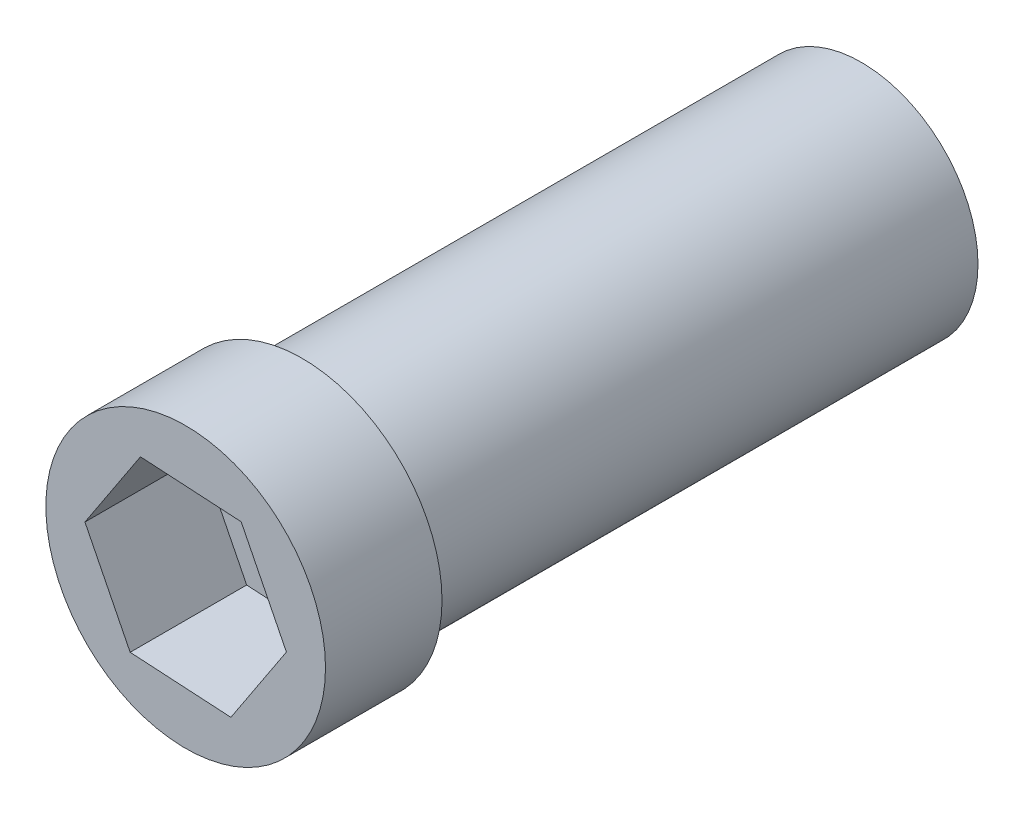
ISO-10303-21;
HEADER;
FILE_DESCRIPTION(('STEP AP214'),'2;1');
FILE_NAME('part.step','',(''),(''),'','','');
FILE_SCHEMA(('AUTOMOTIVE_DESIGN { 1 0 10303 214 1 1 1 1 }'));
ENDSEC;
DATA;
#1=APPLICATION_CONTEXT('core data for automotive mechanical design processes');
#2=APPLICATION_PROTOCOL_DEFINITION('international standard','automotive_design',2000,#1);
#3=PRODUCT_CONTEXT('',#1,'mechanical');
#4=PRODUCT('Part','Part','',(#3));
#5=PRODUCT_RELATED_PRODUCT_CATEGORY('part','',(#4));
#6=PRODUCT_DEFINITION_FORMATION('','',#4);
#7=PRODUCT_DEFINITION_CONTEXT('part definition',#1,'design');
#8=PRODUCT_DEFINITION('design','',#6,#7);
#9=PRODUCT_DEFINITION_SHAPE('','',#8);
#10=(LENGTH_UNIT() NAMED_UNIT(*) SI_UNIT(.MILLI.,.METRE.));
#11=(NAMED_UNIT(*) PLANE_ANGLE_UNIT() SI_UNIT($,.RADIAN.));
#12=(NAMED_UNIT(*) SI_UNIT($,.STERADIAN.) SOLID_ANGLE_UNIT());
#13=UNCERTAINTY_MEASURE_WITH_UNIT(LENGTH_MEASURE(1.E-05),#10,'distance_accuracy_value','');
#14=(GEOMETRIC_REPRESENTATION_CONTEXT(3) GLOBAL_UNCERTAINTY_ASSIGNED_CONTEXT((#13)) GLOBAL_UNIT_ASSIGNED_CONTEXT((#10,
#11,#12)) REPRESENTATION_CONTEXT('',''));
#15=CARTESIAN_POINT('',(0.,0.,0.));
#16=DIRECTION('',(0.,0.,1.));
#17=DIRECTION('',(1.,0.,0.));
#18=AXIS2_PLACEMENT_3D('',#15,#16,#17);
#19=CARTESIAN_POINT('',(0.,0.,-15.24));
#20=DIRECTION('',(0.,0.,1.));
#21=DIRECTION('',(1.,0.,0.));
#22=AXIS2_PLACEMENT_3D('',#19,#20,#21);
#23=CYLINDRICAL_SURFACE('',#22,3.175);
#24=CARTESIAN_POINT('',(0.,0.,-15.24));
#25=DIRECTION('',(0.,0.,1.));
#26=DIRECTION('',(1.,0.,0.));
#27=AXIS2_PLACEMENT_3D('',#24,#25,#26);
#28=CIRCLE('',#27,3.175);
#29=CARTESIAN_POINT('',(3.175,0.,-15.24));
#30=VERTEX_POINT('',#29);
#31=EDGE_CURVE('E11',#30,#30,#28,.T.);
#32=CARTESIAN_POINT('',(0.,0.,0.));
#33=DIRECTION('',(0.,0.,1.));
#34=DIRECTION('',(1.,0.,0.));
#35=AXIS2_PLACEMENT_3D('',#32,#33,#34);
#36=CIRCLE('',#35,3.175);
#37=CARTESIAN_POINT('',(3.175,0.,0.));
#38=VERTEX_POINT('',#37);
#39=EDGE_CURVE('E42',#38,#38,#36,.T.);
#40=CARTESIAN_POINT('',(3.175,0.,-15.24));
#41=CARTESIAN_POINT('',(3.175,0.,-15.08125));
#42=CARTESIAN_POINT('',(3.175,0.,-14.9225));
#43=CARTESIAN_POINT('',(3.175,0.,-14.605));
#44=CARTESIAN_POINT('',(3.175,0.,-14.44625));
#45=CARTESIAN_POINT('',(3.175,0.,-14.12875));
#46=CARTESIAN_POINT('',(3.175,0.,-13.97));
#47=CARTESIAN_POINT('',(3.175,0.,-13.6525));
#48=CARTESIAN_POINT('',(3.175,0.,-13.49375));
#49=CARTESIAN_POINT('',(3.175,0.,-13.17625));
#50=CARTESIAN_POINT('',(3.175,0.,-13.0175));
#51=CARTESIAN_POINT('',(3.175,0.,-12.7));
#52=CARTESIAN_POINT('',(3.175,0.,-12.54125));
#53=CARTESIAN_POINT('',(3.175,0.,-12.22375));
#54=CARTESIAN_POINT('',(3.175,0.,-12.065));
#55=CARTESIAN_POINT('',(3.175,0.,-11.7475));
#56=CARTESIAN_POINT('',(3.175,0.,-11.58875));
#57=CARTESIAN_POINT('',(3.175,0.,-11.27125));
#58=CARTESIAN_POINT('',(3.175,0.,-11.1125));
#59=CARTESIAN_POINT('',(3.175,0.,-10.795));
#60=CARTESIAN_POINT('',(3.175,0.,-10.63625));
#61=CARTESIAN_POINT('',(3.175,0.,-10.31875));
#62=CARTESIAN_POINT('',(3.175,0.,-10.16));
#63=CARTESIAN_POINT('',(3.175,0.,-9.8425));
#64=CARTESIAN_POINT('',(3.175,0.,-9.68375));
#65=CARTESIAN_POINT('',(3.175,0.,-9.36625));
#66=CARTESIAN_POINT('',(3.175,0.,-9.2075));
#67=CARTESIAN_POINT('',(3.175,0.,-8.89));
#68=CARTESIAN_POINT('',(3.175,0.,-8.73125));
#69=CARTESIAN_POINT('',(3.175,0.,-8.41375));
#70=CARTESIAN_POINT('',(3.175,0.,-8.255));
#71=CARTESIAN_POINT('',(3.175,0.,-7.9375));
#72=CARTESIAN_POINT('',(3.175,0.,-7.77875));
#73=CARTESIAN_POINT('',(3.175,0.,-7.46125));
#74=CARTESIAN_POINT('',(3.175,0.,-7.3025));
#75=CARTESIAN_POINT('',(3.175,0.,-6.985));
#76=CARTESIAN_POINT('',(3.175,0.,-6.82625));
#77=CARTESIAN_POINT('',(3.175,0.,-6.50875));
#78=CARTESIAN_POINT('',(3.175,0.,-6.35));
#79=CARTESIAN_POINT('',(3.175,0.,-6.0325));
#80=CARTESIAN_POINT('',(3.175,0.,-5.87375));
#81=CARTESIAN_POINT('',(3.175,0.,-5.55625));
#82=CARTESIAN_POINT('',(3.175,0.,-5.3975));
#83=CARTESIAN_POINT('',(3.175,0.,-5.08));
#84=CARTESIAN_POINT('',(3.175,0.,-4.92125));
#85=CARTESIAN_POINT('',(3.175,0.,-4.60375));
#86=CARTESIAN_POINT('',(3.175,0.,-4.445));
#87=CARTESIAN_POINT('',(3.175,0.,-4.1275));
#88=CARTESIAN_POINT('',(3.175,0.,-3.96875));
#89=CARTESIAN_POINT('',(3.175,0.,-3.65125));
#90=CARTESIAN_POINT('',(3.175,0.,-3.4925));
#91=CARTESIAN_POINT('',(3.175,0.,-3.175));
#92=CARTESIAN_POINT('',(3.175,0.,-3.01625));
#93=CARTESIAN_POINT('',(3.175,0.,-2.69875));
#94=CARTESIAN_POINT('',(3.175,0.,-2.54));
#95=CARTESIAN_POINT('',(3.175,0.,-2.2225));
#96=CARTESIAN_POINT('',(3.175,0.,-2.06375));
#97=CARTESIAN_POINT('',(3.175,0.,-1.74625));
#98=CARTESIAN_POINT('',(3.175,0.,-1.5875));
#99=CARTESIAN_POINT('',(3.175,0.,-1.27));
#100=CARTESIAN_POINT('',(3.175,0.,-1.11125));
#101=CARTESIAN_POINT('',(3.175,0.,-0.79375));
#102=CARTESIAN_POINT('',(3.175,0.,-0.634999999999999));
#103=CARTESIAN_POINT('',(3.175,0.,-0.3175));
#104=CARTESIAN_POINT('',(3.175,0.,-0.15875));
#105=CARTESIAN_POINT('',(3.175,0.,0.));
#106=B_SPLINE_CURVE_WITH_KNOTS('',3,(#40,#41,#42,#43,#44,#45,#46,#47,#48,#49,#50,#51,#52,#53,
#54,#55,#56,#57,#58,#59,#60,#61,#62,#63,#64,#65,#66,#67,#68,#69,#70,#71,#72,#73,#74,#75,#76,#77,
#78,#79,#80,#81,#82,#83,#84,#85,#86,#87,#88,#89,#90,#91,#92,#93,#94,#95,#96,#97,#98,#99,#100,
#101,#102,#103,#104,#105),.UNSPECIFIED.,.F.,.F.,(4,2,2,2,2,2,2,2,2,2,2,2,2,2,2,2,2,2,2,2,2,2,2,
2,2,2,2,2,2,2,2,2,4),(0.,0.476250000000001,0.9525,1.42875,1.905,2.38125,2.8575,3.33375,3.81,
4.28625,4.7625,5.23875,5.715,6.19125,6.6675,7.14375,7.62,8.09625,8.5725,9.04875,9.525,10.00125,
10.4775,10.95375,11.43,11.90625,12.3825,12.85875,13.335,13.81125,14.2875,14.76375,15.24),.UNSPECIFIED.);
#107=EDGE_CURVE('BSEAM39',#30,#38,#106,.T.);
#108=ORIENTED_EDGE('',*,*,#31,.T.);
#109=ORIENTED_EDGE('',*,*,#39,.F.);
#110=ORIENTED_EDGE('',*,*,#107,.T.);
#111=ORIENTED_EDGE('',*,*,#107,.F.);
#112=EDGE_LOOP('',(#108,#110,#109,#111));
#113=FACE_BOUND('',#112,.T.);
#114=ADVANCED_FACE('F39',(#113),#23,.T.);
#115=CARTESIAN_POINT('',(0.,0.,-15.24));
#116=DIRECTION('',(0.,0.,1.));
#117=DIRECTION('',(1.,0.,0.));
#118=AXIS2_PLACEMENT_3D('',#115,#116,#117);
#119=PLANE('',#118);
#120=ORIENTED_EDGE('',*,*,#31,.F.);
#121=EDGE_LOOP('',(#120));
#122=FACE_BOUND('',#121,.T.);
#123=ADVANCED_FACE('F190',(#122),#119,.F.);
#124=CARTESIAN_POINT('',(0.,0.,3.175));
#125=DIRECTION('',(0.,0.,-1.));
#126=DIRECTION('',(-1.,0.,0.));
#127=AXIS2_PLACEMENT_3D('',#124,#125,#126);
#128=CYLINDRICAL_SURFACE('',#127,3.81);
#129=CARTESIAN_POINT('',(0.,0.,3.175));
#130=DIRECTION('',(0.,0.,1.));
#131=DIRECTION('',(1.,0.,0.));
#132=AXIS2_PLACEMENT_3D('',#129,#130,#131);
#133=CIRCLE('',#132,3.81);
#134=CARTESIAN_POINT('',(3.81,0.,3.175));
#135=VERTEX_POINT('',#134);
#136=EDGE_CURVE('E163',#135,#135,#133,.T.);
#137=ORIENTED_EDGE('',*,*,#136,.F.);
#138=EDGE_LOOP('',(#137));
#139=FACE_BOUND('',#138,.T.);
#140=CARTESIAN_POINT('',(0.,0.,0.));
#141=DIRECTION('',(0.,0.,1.));
#142=DIRECTION('',(1.,0.,0.));
#143=AXIS2_PLACEMENT_3D('',#140,#141,#142);
#144=CIRCLE('',#143,3.81);
#145=CARTESIAN_POINT('',(3.81,0.,0.));
#146=VERTEX_POINT('',#145);
#147=EDGE_CURVE('E153',#146,#146,#144,.T.);
#148=ORIENTED_EDGE('',*,*,#147,.T.);
#149=EDGE_LOOP('',(#148));
#150=FACE_BOUND('',#149,.T.);
#151=ADVANCED_FACE('F171',(#139,#150),#128,.T.);
#152=CARTESIAN_POINT('',(0.,0.,3.175));
#153=DIRECTION('',(0.,0.,1.));
#154=DIRECTION('',(1.,0.,0.));
#155=AXIS2_PLACEMENT_3D('',#152,#153,#154);
#156=PLANE('',#155);
#157=DIRECTION('',(-0.550129463711656,-0.835079381350256,0.));
#158=VECTOR('',#157,1.);
#159=CARTESIAN_POINT('',(-1.23220635746574,2.45807571946452,3.175));
#160=LINE('',#159,#158);
#161=CARTESIAN_POINT('',(-1.23220635746574,2.45807571946452,3.175));
#162=VERTEX_POINT('',#161);
#163=CARTESIAN_POINT('',(-2.74485919621486,0.16191585146224,3.175));
#164=VERTEX_POINT('',#163);
#165=EDGE_CURVE('E54',#162,#164,#160,.T.);
#166=ORIENTED_EDGE('',*,*,#165,.F.);
#167=DIRECTION('',(-0.998264690281742,0.0588864002694755,0.));
#168=VECTOR('',#167,1.);
#169=CARTESIAN_POINT('',(1.51265283874911,2.29615986800228,3.175));
#170=LINE('',#169,#168);
#171=CARTESIAN_POINT('',(1.51265283874911,2.29615986800228,3.175));
#172=VERTEX_POINT('',#171);
#173=EDGE_CURVE('E147',#172,#162,#170,.T.);
#174=ORIENTED_EDGE('',*,*,#173,.F.);
#175=DIRECTION('',(-0.448135226570086,0.893965781619731,0.));
#176=VECTOR('',#175,1.);
#177=CARTESIAN_POINT('',(2.74485919621485,-0.161915851462241,3.175));
#178=LINE('',#177,#176);
#179=CARTESIAN_POINT('',(2.74485919621485,-0.161915851462241,3.175));
#180=VERTEX_POINT('',#179);
#181=EDGE_CURVE('E144',#180,#172,#178,.T.);
#182=ORIENTED_EDGE('',*,*,#181,.F.);
#183=DIRECTION('',(0.550129463711656,0.835079381350256,0.));
#184=VECTOR('',#183,1.);
#185=CARTESIAN_POINT('',(1.23220635746574,-2.45807571946452,3.175));
#186=LINE('',#185,#184);
#187=CARTESIAN_POINT('',(1.23220635746574,-2.45807571946452,3.175));
#188=VERTEX_POINT('',#187);
#189=EDGE_CURVE('E102',#188,#180,#186,.T.);
#190=ORIENTED_EDGE('',*,*,#189,.F.);
#191=DIRECTION('',(0.998264690281742,-0.0588864002694756,0.));
#192=VECTOR('',#191,1.);
#193=CARTESIAN_POINT('',(-1.51265283874912,-2.29615986800228,3.175));
#194=LINE('',#193,#192);
#195=CARTESIAN_POINT('',(-1.51265283874912,-2.29615986800228,3.175));
#196=VERTEX_POINT('',#195);
#197=EDGE_CURVE('E138',#196,#188,#194,.T.);
#198=ORIENTED_EDGE('',*,*,#197,.F.);
#199=DIRECTION('',(0.448135226570087,-0.893965781619731,0.));
#200=VECTOR('',#199,1.);
#201=CARTESIAN_POINT('',(-2.74485919621486,0.16191585146224,3.175));
#202=LINE('',#201,#200);
#203=EDGE_CURVE('E134',#164,#196,#202,.T.);
#204=ORIENTED_EDGE('',*,*,#203,.F.);
#205=EDGE_LOOP('',(#166,#174,#182,#190,#198,#204));
#206=FACE_BOUND('',#205,.T.);
#207=ORIENTED_EDGE('',*,*,#136,.T.);
#208=EDGE_LOOP('',(#207));
#209=FACE_BOUND('',#208,.T.);
#210=ADVANCED_FACE('F176',(#206,#209),#156,.T.);
#211=CARTESIAN_POINT('',(0.,0.,0.));
#212=DIRECTION('',(0.,0.,1.));
#213=DIRECTION('',(1.,0.,0.));
#214=AXIS2_PLACEMENT_3D('',#211,#212,#213);
#215=PLANE('',#214);
#216=ORIENTED_EDGE('',*,*,#39,.T.);
#217=EDGE_LOOP('',(#216));
#218=FACE_BOUND('',#217,.T.);
#219=ORIENTED_EDGE('',*,*,#147,.F.);
#220=EDGE_LOOP('',(#219));
#221=FACE_BOUND('',#220,.T.);
#222=ADVANCED_FACE('F173',(#218,#221),#215,.F.);
#223=CARTESIAN_POINT('',(-1.23220635746574,2.45807571946452,0.));
#224=DIRECTION('',(-0.835079381350256,0.550129463711656,0.));
#225=DIRECTION('',(-0.550129463711656,-0.835079381350256,0.));
#226=AXIS2_PLACEMENT_3D('',#223,#224,#225);
#227=PLANE('',#226);
#228=ORIENTED_EDGE('',*,*,#165,.T.);
#229=DIRECTION('',(0.,0.,1.));
#230=VECTOR('',#229,1.);
#231=CARTESIAN_POINT('',(-2.74485919621486,0.16191585146224,0.));
#232=LINE('',#231,#230);
#233=CARTESIAN_POINT('',(-2.74485919621486,0.16191585146224,0.));
#234=VERTEX_POINT('',#233);
#235=EDGE_CURVE('E84',#234,#164,#232,.T.);
#236=ORIENTED_EDGE('',*,*,#235,.F.);
#237=DIRECTION('',(-0.550129463711656,-0.835079381350256,0.));
#238=VECTOR('',#237,1.);
#239=CARTESIAN_POINT('',(-1.23220635746574,2.45807571946452,0.));
#240=LINE('',#239,#238);
#241=CARTESIAN_POINT('',(-1.23220635746574,2.45807571946452,0.));
#242=VERTEX_POINT('',#241);
#243=EDGE_CURVE('E150',#242,#234,#240,.T.);
#244=ORIENTED_EDGE('',*,*,#243,.F.);
#245=DIRECTION('',(0.,0.,1.));
#246=VECTOR('',#245,1.);
#247=CARTESIAN_POINT('',(-1.23220635746574,2.45807571946452,0.));
#248=LINE('',#247,#246);
#249=EDGE_CURVE('E62',#242,#162,#248,.T.);
#250=ORIENTED_EDGE('',*,*,#249,.T.);
#251=EDGE_LOOP('',(#228,#236,#244,#250));
#252=FACE_BOUND('',#251,.T.);
#253=ADVANCED_FACE('F175',(#252),#227,.F.);
#254=CARTESIAN_POINT('',(1.51265283874911,2.29615986800228,0.));
#255=DIRECTION('',(0.0588864002694755,0.998264690281742,0.));
#256=DIRECTION('',(-0.998264690281743,0.0588864002694755,0.));
#257=AXIS2_PLACEMENT_3D('',#254,#255,#256);
#258=PLANE('',#257);
#259=ORIENTED_EDGE('',*,*,#173,.T.);
#260=ORIENTED_EDGE('',*,*,#249,.F.);
#261=DIRECTION('',(-0.998264690281742,0.0588864002694755,0.));
#262=VECTOR('',#261,1.);
#263=CARTESIAN_POINT('',(1.51265283874911,2.29615986800228,0.));
#264=LINE('',#263,#262);
#265=CARTESIAN_POINT('',(1.51265283874911,2.29615986800228,0.));
#266=VERTEX_POINT('',#265);
#267=EDGE_CURVE('E116',#266,#242,#264,.T.);
#268=ORIENTED_EDGE('',*,*,#267,.F.);
#269=DIRECTION('',(0.,0.,1.));
#270=VECTOR('',#269,1.);
#271=CARTESIAN_POINT('',(1.51265283874911,2.29615986800228,0.));
#272=LINE('',#271,#270);
#273=EDGE_CURVE('E107',#266,#172,#272,.T.);
#274=ORIENTED_EDGE('',*,*,#273,.T.);
#275=EDGE_LOOP('',(#259,#260,#268,#274));
#276=FACE_BOUND('',#275,.T.);
#277=ADVANCED_FACE('F183',(#276),#258,.F.);
#278=CARTESIAN_POINT('',(2.74485919621485,-0.161915851462241,0.));
#279=DIRECTION('',(0.893965781619731,0.448135226570086,0.));
#280=DIRECTION('',(-0.448135226570086,0.893965781619732,0.));
#281=AXIS2_PLACEMENT_3D('',#278,#279,#280);
#282=PLANE('',#281);
#283=ORIENTED_EDGE('',*,*,#181,.T.);
#284=ORIENTED_EDGE('',*,*,#273,.F.);
#285=DIRECTION('',(-0.448135226570086,0.893965781619731,0.));
#286=VECTOR('',#285,1.);
#287=CARTESIAN_POINT('',(2.74485919621485,-0.161915851462241,0.));
#288=LINE('',#287,#286);
#289=CARTESIAN_POINT('',(2.74485919621485,-0.161915851462241,0.));
#290=VERTEX_POINT('',#289);
#291=EDGE_CURVE('E111',#290,#266,#288,.T.);
#292=ORIENTED_EDGE('',*,*,#291,.F.);
#293=DIRECTION('',(0.,0.,1.));
#294=VECTOR('',#293,1.);
#295=CARTESIAN_POINT('',(2.74485919621485,-0.161915851462241,0.));
#296=LINE('',#295,#294);
#297=EDGE_CURVE('E95',#290,#180,#296,.T.);
#298=ORIENTED_EDGE('',*,*,#297,.T.);
#299=EDGE_LOOP('',(#283,#284,#292,#298));
#300=FACE_BOUND('',#299,.T.);
#301=ADVANCED_FACE('F112',(#300),#282,.F.);
#302=CARTESIAN_POINT('',(1.23220635746574,-2.45807571946452,0.));
#303=DIRECTION('',(0.835079381350256,-0.550129463711656,0.));
#304=DIRECTION('',(0.550129463711656,0.835079381350256,0.));
#305=AXIS2_PLACEMENT_3D('',#302,#303,#304);
#306=PLANE('',#305);
#307=ORIENTED_EDGE('',*,*,#189,.T.);
#308=ORIENTED_EDGE('',*,*,#297,.F.);
#309=DIRECTION('',(0.550129463711656,0.835079381350256,0.));
#310=VECTOR('',#309,1.);
#311=CARTESIAN_POINT('',(1.23220635746574,-2.45807571946452,0.));
#312=LINE('',#311,#310);
#313=CARTESIAN_POINT('',(1.23220635746574,-2.45807571946452,0.));
#314=VERTEX_POINT('',#313);
#315=EDGE_CURVE('E99',#314,#290,#312,.T.);
#316=ORIENTED_EDGE('',*,*,#315,.F.);
#317=DIRECTION('',(0.,0.,1.));
#318=VECTOR('',#317,1.);
#319=CARTESIAN_POINT('',(1.23220635746574,-2.45807571946452,0.));
#320=LINE('',#319,#318);
#321=EDGE_CURVE('E108',#314,#188,#320,.T.);
#322=ORIENTED_EDGE('',*,*,#321,.T.);
#323=EDGE_LOOP('',(#307,#308,#316,#322));
#324=FACE_BOUND('',#323,.T.);
#325=ADVANCED_FACE('F97',(#324),#306,.F.);
#326=CARTESIAN_POINT('',(-1.51265283874912,-2.29615986800228,0.));
#327=DIRECTION('',(-0.0588864002694756,-0.998264690281742,0.));
#328=DIRECTION('',(0.998264690281743,-0.0588864002694756,0.));
#329=AXIS2_PLACEMENT_3D('',#326,#327,#328);
#330=PLANE('',#329);
#331=ORIENTED_EDGE('',*,*,#197,.T.);
#332=ORIENTED_EDGE('',*,*,#321,.F.);
#333=DIRECTION('',(0.998264690281742,-0.0588864002694756,0.));
#334=VECTOR('',#333,1.);
#335=CARTESIAN_POINT('',(-1.51265283874912,-2.29615986800228,0.));
#336=LINE('',#335,#334);
#337=CARTESIAN_POINT('',(-1.51265283874912,-2.29615986800228,0.));
#338=VERTEX_POINT('',#337);
#339=EDGE_CURVE('E122',#338,#314,#336,.T.);
#340=ORIENTED_EDGE('',*,*,#339,.F.);
#341=DIRECTION('',(0.,0.,1.));
#342=VECTOR('',#341,1.);
#343=CARTESIAN_POINT('',(-1.51265283874912,-2.29615986800228,0.));
#344=LINE('',#343,#342);
#345=EDGE_CURVE('E158',#338,#196,#344,.T.);
#346=ORIENTED_EDGE('',*,*,#345,.T.);
#347=EDGE_LOOP('',(#331,#332,#340,#346));
#348=FACE_BOUND('',#347,.T.);
#349=ADVANCED_FACE('F245',(#348),#330,.F.);
#350=CARTESIAN_POINT('',(-2.74485919621486,0.16191585146224,0.));
#351=DIRECTION('',(-0.893965781619731,-0.448135226570087,0.));
#352=DIRECTION('',(0.448135226570087,-0.893965781619732,0.));
#353=AXIS2_PLACEMENT_3D('',#350,#351,#352);
#354=PLANE('',#353);
#355=ORIENTED_EDGE('',*,*,#203,.T.);
#356=ORIENTED_EDGE('',*,*,#345,.F.);
#357=DIRECTION('',(0.448135226570087,-0.893965781619731,0.));
#358=VECTOR('',#357,1.);
#359=CARTESIAN_POINT('',(-2.74485919621486,0.16191585146224,0.));
#360=LINE('',#359,#358);
#361=EDGE_CURVE('E126',#234,#338,#360,.T.);
#362=ORIENTED_EDGE('',*,*,#361,.F.);
#363=ORIENTED_EDGE('',*,*,#235,.T.);
#364=EDGE_LOOP('',(#355,#356,#362,#363));
#365=FACE_BOUND('',#364,.T.);
#366=ADVANCED_FACE('F254',(#365),#354,.F.);
#367=CARTESIAN_POINT('',(0.,0.,0.));
#368=DIRECTION('',(0.,0.,1.));
#369=DIRECTION('',(1.,0.,0.));
#370=AXIS2_PLACEMENT_3D('',#367,#368,#369);
#371=PLANE('',#370);
#372=ORIENTED_EDGE('',*,*,#243,.T.);
#373=ORIENTED_EDGE('',*,*,#361,.T.);
#374=ORIENTED_EDGE('',*,*,#339,.T.);
#375=ORIENTED_EDGE('',*,*,#315,.T.);
#376=ORIENTED_EDGE('',*,*,#291,.T.);
#377=ORIENTED_EDGE('',*,*,#267,.T.);
#378=EDGE_LOOP('',(#372,#373,#374,#375,#376,#377));
#379=FACE_BOUND('',#378,.T.);
#380=ADVANCED_FACE('F119',(#379),#371,.T.);
#381=CLOSED_SHELL('',(#114,#123,#151,#210,#222,#253,#277,#301,#325,#349,#366,#380));
#382=MANIFOLD_SOLID_BREP('B2',#381);
#383=ADVANCED_BREP_SHAPE_REPRESENTATION('',(#18,#382),#14);
#384=SHAPE_DEFINITION_REPRESENTATION(#9,#383);
ENDSEC;
END-ISO-10303-21;
